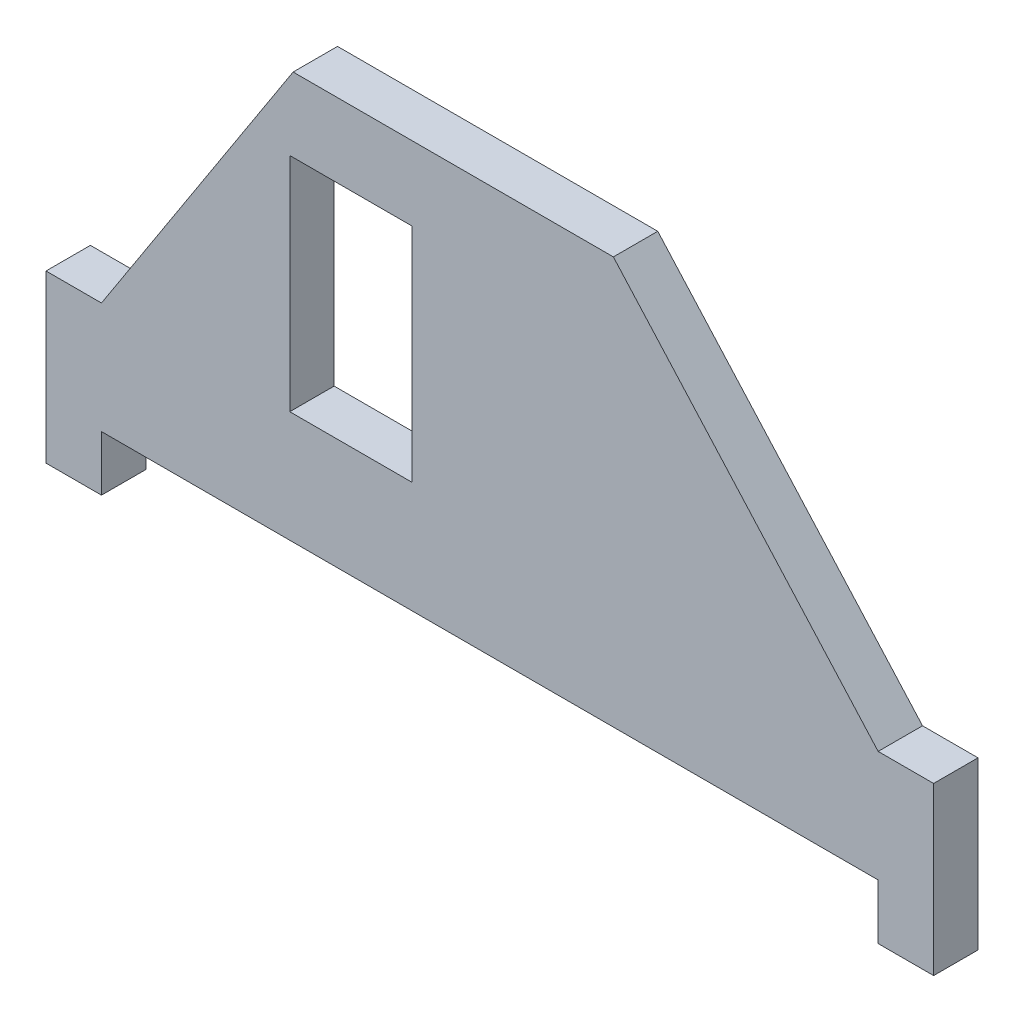
ISO-10303-21;
HEADER;
FILE_DESCRIPTION(('STEP AP214'),'2;1');
FILE_NAME('part.step','',(''),(''),'','','');
FILE_SCHEMA(('AUTOMOTIVE_DESIGN { 1 0 10303 214 1 1 1 1 }'));
ENDSEC;
DATA;
#1=APPLICATION_CONTEXT('core data for automotive mechanical design processes');
#2=APPLICATION_PROTOCOL_DEFINITION('international standard','automotive_design',2000,#1);
#3=PRODUCT_CONTEXT('',#1,'mechanical');
#4=PRODUCT('Part','Part','',(#3));
#5=PRODUCT_RELATED_PRODUCT_CATEGORY('part','',(#4));
#6=PRODUCT_DEFINITION_FORMATION('','',#4);
#7=PRODUCT_DEFINITION_CONTEXT('part definition',#1,'design');
#8=PRODUCT_DEFINITION('design','',#6,#7);
#9=PRODUCT_DEFINITION_SHAPE('','',#8);
#10=(LENGTH_UNIT() NAMED_UNIT(*) SI_UNIT(.MILLI.,.METRE.));
#11=(NAMED_UNIT(*) PLANE_ANGLE_UNIT() SI_UNIT($,.RADIAN.));
#12=(NAMED_UNIT(*) SI_UNIT($,.STERADIAN.) SOLID_ANGLE_UNIT());
#13=UNCERTAINTY_MEASURE_WITH_UNIT(LENGTH_MEASURE(1.E-05),#10,'distance_accuracy_value','');
#14=(GEOMETRIC_REPRESENTATION_CONTEXT(3) GLOBAL_UNCERTAINTY_ASSIGNED_CONTEXT((#13)) GLOBAL_UNIT_ASSIGNED_CONTEXT((#10,
#11,#12)) REPRESENTATION_CONTEXT('',''));
#15=CARTESIAN_POINT('',(0.,0.,0.));
#16=DIRECTION('',(0.,0.,1.));
#17=DIRECTION('',(1.,0.,0.));
#18=AXIS2_PLACEMENT_3D('',#15,#16,#17);
#19=CARTESIAN_POINT('',(1905.,0.,101.6));
#20=DIRECTION('',(-1.,0.,0.));
#21=DIRECTION('',(0.,0.,1.));
#22=AXIS2_PLACEMENT_3D('',#19,#20,#21);
#23=PLANE('',#22);
#24=DIRECTION('',(0.,1.,0.));
#25=VECTOR('',#24,1.);
#26=CARTESIAN_POINT('',(1905.,0.,0.));
#27=LINE('',#26,#25);
#28=CARTESIAN_POINT('',(1905.,0.,0.));
#29=VERTEX_POINT('',#28);
#30=CARTESIAN_POINT('',(1905.,126.13351164283,0.));
#31=VERTEX_POINT('',#30);
#32=EDGE_CURVE('E241',#29,#31,#27,.T.);
#33=ORIENTED_EDGE('',*,*,#32,.F.);
#34=DIRECTION('',(0.,0.,-1.));
#35=VECTOR('',#34,1.);
#36=CARTESIAN_POINT('',(1905.,0.,101.6));
#37=LINE('',#36,#35);
#38=CARTESIAN_POINT('',(1905.,0.,101.6));
#39=VERTEX_POINT('',#38);
#40=EDGE_CURVE('E11',#39,#29,#37,.T.);
#41=ORIENTED_EDGE('',*,*,#40,.F.);
#42=DIRECTION('',(0.,1.,0.));
#43=VECTOR('',#42,1.);
#44=CARTESIAN_POINT('',(1905.,0.,101.6));
#45=LINE('',#44,#43);
#46=CARTESIAN_POINT('',(1905.,126.13351164283,101.6));
#47=VERTEX_POINT('',#46);
#48=EDGE_CURVE('E276',#39,#47,#45,.T.);
#49=ORIENTED_EDGE('',*,*,#48,.T.);
#50=DIRECTION('',(0.,0.,-1.));
#51=VECTOR('',#50,1.);
#52=CARTESIAN_POINT('',(1905.,126.13351164283,101.6));
#53=LINE('',#52,#51);
#54=EDGE_CURVE('E112',#47,#31,#53,.T.);
#55=ORIENTED_EDGE('',*,*,#54,.T.);
#56=EDGE_LOOP('',(#33,#41,#49,#55));
#57=FACE_BOUND('',#56,.T.);
#58=ADVANCED_FACE('F35',(#57),#23,.T.);
#59=CARTESIAN_POINT('',(0.,0.,101.6));
#60=DIRECTION('',(0.,1.,0.));
#61=DIRECTION('',(0.,0.,1.));
#62=AXIS2_PLACEMENT_3D('',#59,#60,#61);
#63=PLANE('',#62);
#64=DIRECTION('',(1.,0.,0.));
#65=VECTOR('',#64,1.);
#66=CARTESIAN_POINT('',(0.,0.,0.));
#67=LINE('',#66,#65);
#68=CARTESIAN_POINT('',(2032.,0.,0.));
#69=VERTEX_POINT('',#68);
#70=EDGE_CURVE('E238',#29,#69,#67,.T.);
#71=ORIENTED_EDGE('',*,*,#70,.T.);
#72=DIRECTION('',(0.,0.,-1.));
#73=VECTOR('',#72,1.);
#74=CARTESIAN_POINT('',(2032.,0.,101.6));
#75=LINE('',#74,#73);
#76=CARTESIAN_POINT('',(2032.,0.,101.6));
#77=VERTEX_POINT('',#76);
#78=EDGE_CURVE('E45',#77,#69,#75,.T.);
#79=ORIENTED_EDGE('',*,*,#78,.F.);
#80=DIRECTION('',(1.,0.,0.));
#81=VECTOR('',#80,1.);
#82=CARTESIAN_POINT('',(0.,0.,101.6));
#83=LINE('',#82,#81);
#84=EDGE_CURVE('E273',#39,#77,#83,.T.);
#85=ORIENTED_EDGE('',*,*,#84,.F.);
#86=ORIENTED_EDGE('',*,*,#40,.T.);
#87=EDGE_LOOP('',(#71,#79,#85,#86));
#88=FACE_BOUND('',#87,.T.);
#89=ADVANCED_FACE('F302',(#88),#63,.F.);
#90=CARTESIAN_POINT('',(2032.,0.,101.6));
#91=DIRECTION('',(-1.,0.,0.));
#92=DIRECTION('',(0.,0.,1.));
#93=AXIS2_PLACEMENT_3D('',#90,#91,#92);
#94=PLANE('',#93);
#95=DIRECTION('',(0.,1.,0.));
#96=VECTOR('',#95,1.);
#97=CARTESIAN_POINT('',(2032.,0.,0.));
#98=LINE('',#97,#96);
#99=CARTESIAN_POINT('',(2032.,381.,0.));
#100=VERTEX_POINT('',#99);
#101=EDGE_CURVE('E235',#69,#100,#98,.T.);
#102=ORIENTED_EDGE('',*,*,#101,.T.);
#103=DIRECTION('',(0.,0.,-1.));
#104=VECTOR('',#103,1.);
#105=CARTESIAN_POINT('',(2032.,381.,101.6));
#106=LINE('',#105,#104);
#107=CARTESIAN_POINT('',(2032.,381.,101.6));
#108=VERTEX_POINT('',#107);
#109=EDGE_CURVE('E196',#108,#100,#106,.T.);
#110=ORIENTED_EDGE('',*,*,#109,.F.);
#111=DIRECTION('',(0.,1.,0.));
#112=VECTOR('',#111,1.);
#113=CARTESIAN_POINT('',(2032.,0.,101.6));
#114=LINE('',#113,#112);
#115=EDGE_CURVE('E271',#77,#108,#114,.T.);
#116=ORIENTED_EDGE('',*,*,#115,.F.);
#117=ORIENTED_EDGE('',*,*,#78,.T.);
#118=EDGE_LOOP('',(#102,#110,#116,#117));
#119=FACE_BOUND('',#118,.T.);
#120=ADVANCED_FACE('F307',(#119),#94,.F.);
#121=CARTESIAN_POINT('',(0.,381.,101.6));
#122=DIRECTION('',(0.,1.,0.));
#123=DIRECTION('',(0.,0.,1.));
#124=AXIS2_PLACEMENT_3D('',#121,#122,#123);
#125=PLANE('',#124);
#126=DIRECTION('',(1.,0.,0.));
#127=VECTOR('',#126,1.);
#128=CARTESIAN_POINT('',(0.,381.,0.));
#129=LINE('',#128,#127);
#130=CARTESIAN_POINT('',(1905.,381.,0.));
#131=VERTEX_POINT('',#130);
#132=EDGE_CURVE('E232',#131,#100,#129,.T.);
#133=ORIENTED_EDGE('',*,*,#132,.F.);
#134=DIRECTION('',(0.,0.,-1.));
#135=VECTOR('',#134,1.);
#136=CARTESIAN_POINT('',(1905.,381.,101.6));
#137=LINE('',#136,#135);
#138=CARTESIAN_POINT('',(1905.,381.,101.6));
#139=VERTEX_POINT('',#138);
#140=EDGE_CURVE('E194',#139,#131,#137,.T.);
#141=ORIENTED_EDGE('',*,*,#140,.F.);
#142=DIRECTION('',(1.,0.,0.));
#143=VECTOR('',#142,1.);
#144=CARTESIAN_POINT('',(0.,381.,101.6));
#145=LINE('',#144,#143);
#146=EDGE_CURVE('E268',#139,#108,#145,.T.);
#147=ORIENTED_EDGE('',*,*,#146,.T.);
#148=ORIENTED_EDGE('',*,*,#109,.T.);
#149=EDGE_LOOP('',(#133,#141,#147,#148));
#150=FACE_BOUND('',#149,.T.);
#151=ADVANCED_FACE('F310',(#150),#125,.T.);
#152=CARTESIAN_POINT('',(1247.19252808395,1116.08241874589,101.6));
#153=DIRECTION('',(0.745189852710884,0.666852370031577,0.));
#154=DIRECTION('',(-0.666852370031577,0.745189852710884,0.));
#155=AXIS2_PLACEMENT_3D('',#152,#153,#154);
#156=PLANE('',#155);
#157=DIRECTION('',(0.666852370031577,-0.745189852710884,0.));
#158=VECTOR('',#157,1.);
#159=CARTESIAN_POINT('',(1247.19252808395,1116.08241874589,0.));
#160=LINE('',#159,#158);
#161=CARTESIAN_POINT('',(1298.87078743548,1058.33333333333,0.));
#162=VERTEX_POINT('',#161);
#163=EDGE_CURVE('E229',#162,#131,#160,.T.);
#164=ORIENTED_EDGE('',*,*,#163,.F.);
#165=DIRECTION('',(0.,0.,-1.));
#166=VECTOR('',#165,1.);
#167=CARTESIAN_POINT('',(1298.87078743548,1058.33333333333,101.6));
#168=LINE('',#167,#166);
#169=CARTESIAN_POINT('',(1298.87078743548,1058.33333333333,101.6));
#170=VERTEX_POINT('',#169);
#171=EDGE_CURVE('E192',#170,#162,#168,.T.);
#172=ORIENTED_EDGE('',*,*,#171,.F.);
#173=DIRECTION('',(0.666852370031577,-0.745189852710884,0.));
#174=VECTOR('',#173,1.);
#175=CARTESIAN_POINT('',(1247.19252808395,1116.08241874589,101.6));
#176=LINE('',#175,#174);
#177=EDGE_CURVE('E265',#170,#139,#176,.T.);
#178=ORIENTED_EDGE('',*,*,#177,.T.);
#179=ORIENTED_EDGE('',*,*,#140,.T.);
#180=EDGE_LOOP('',(#164,#172,#178,#179));
#181=FACE_BOUND('',#180,.T.);
#182=ADVANCED_FACE('F313',(#181),#156,.T.);
#183=CARTESIAN_POINT('',(0.,1058.33333333333,101.6));
#184=DIRECTION('',(0.,1.,0.));
#185=DIRECTION('',(0.,0.,1.));
#186=AXIS2_PLACEMENT_3D('',#183,#184,#185);
#187=PLANE('',#186);
#188=DIRECTION('',(1.,0.,0.));
#189=VECTOR('',#188,1.);
#190=CARTESIAN_POINT('',(0.,1058.33333333333,0.));
#191=LINE('',#190,#189);
#192=CARTESIAN_POINT('',(565.751483096429,1058.33333333333,0.));
#193=VERTEX_POINT('',#192);
#194=EDGE_CURVE('E226',#193,#162,#191,.T.);
#195=ORIENTED_EDGE('',*,*,#194,.F.);
#196=DIRECTION('',(0.,0.,-1.));
#197=VECTOR('',#196,1.);
#198=CARTESIAN_POINT('',(565.751483096429,1058.33333333333,101.6));
#199=LINE('',#198,#197);
#200=CARTESIAN_POINT('',(565.751483096429,1058.33333333333,101.6));
#201=VERTEX_POINT('',#200);
#202=EDGE_CURVE('E190',#201,#193,#199,.T.);
#203=ORIENTED_EDGE('',*,*,#202,.F.);
#204=DIRECTION('',(1.,0.,0.));
#205=VECTOR('',#204,1.);
#206=CARTESIAN_POINT('',(0.,1058.33333333333,101.6));
#207=LINE('',#206,#205);
#208=EDGE_CURVE('E262',#201,#170,#207,.T.);
#209=ORIENTED_EDGE('',*,*,#208,.T.);
#210=ORIENTED_EDGE('',*,*,#171,.T.);
#211=EDGE_LOOP('',(#195,#203,#209,#210));
#212=FACE_BOUND('',#211,.T.);
#213=ADVANCED_FACE('F318',(#212),#187,.T.);
#214=CARTESIAN_POINT('',(-84.3885381116742,54.6637739953296,101.6));
#215=DIRECTION('',(-0.839300486720766,0.543667814929563,0.));
#216=DIRECTION('',(-0.543667814929563,-0.839300486720766,0.));
#217=AXIS2_PLACEMENT_3D('',#214,#215,#216);
#218=PLANE('',#217);
#219=DIRECTION('',(0.543667814929563,0.839300486720766,0.));
#220=VECTOR('',#219,1.);
#221=CARTESIAN_POINT('',(-84.3885381116742,54.6637739953296,0.));
#222=LINE('',#221,#220);
#223=CARTESIAN_POINT('',(127.,381.,0.));
#224=VERTEX_POINT('',#223);
#225=EDGE_CURVE('E223',#224,#193,#222,.T.);
#226=ORIENTED_EDGE('',*,*,#225,.F.);
#227=DIRECTION('',(0.,0.,-1.));
#228=VECTOR('',#227,1.);
#229=CARTESIAN_POINT('',(127.,381.,101.6));
#230=LINE('',#229,#228);
#231=CARTESIAN_POINT('',(127.,381.,101.6));
#232=VERTEX_POINT('',#231);
#233=EDGE_CURVE('E188',#232,#224,#230,.T.);
#234=ORIENTED_EDGE('',*,*,#233,.F.);
#235=DIRECTION('',(0.543667814929563,0.839300486720766,0.));
#236=VECTOR('',#235,1.);
#237=CARTESIAN_POINT('',(-84.3885381116742,54.6637739953296,101.6));
#238=LINE('',#237,#236);
#239=EDGE_CURVE('E259',#232,#201,#238,.T.);
#240=ORIENTED_EDGE('',*,*,#239,.T.);
#241=ORIENTED_EDGE('',*,*,#202,.T.);
#242=EDGE_LOOP('',(#226,#234,#240,#241));
#243=FACE_BOUND('',#242,.T.);
#244=ADVANCED_FACE('F321',(#243),#218,.T.);
#245=CARTESIAN_POINT('',(0.,381.,101.6));
#246=DIRECTION('',(0.,1.,0.));
#247=DIRECTION('',(0.,0.,1.));
#248=AXIS2_PLACEMENT_3D('',#245,#246,#247);
#249=PLANE('',#248);
#250=DIRECTION('',(1.,0.,0.));
#251=VECTOR('',#250,1.);
#252=CARTESIAN_POINT('',(0.,381.,0.));
#253=LINE('',#252,#251);
#254=CARTESIAN_POINT('',(0.,381.,0.));
#255=VERTEX_POINT('',#254);
#256=EDGE_CURVE('E220',#255,#224,#253,.T.);
#257=ORIENTED_EDGE('',*,*,#256,.F.);
#258=DIRECTION('',(0.,0.,-1.));
#259=VECTOR('',#258,1.);
#260=CARTESIAN_POINT('',(0.,381.,101.6));
#261=LINE('',#260,#259);
#262=CARTESIAN_POINT('',(0.,381.,101.6));
#263=VERTEX_POINT('',#262);
#264=EDGE_CURVE('E182',#263,#255,#261,.T.);
#265=ORIENTED_EDGE('',*,*,#264,.F.);
#266=DIRECTION('',(1.,0.,0.));
#267=VECTOR('',#266,1.);
#268=CARTESIAN_POINT('',(0.,381.,101.6));
#269=LINE('',#268,#267);
#270=EDGE_CURVE('E256',#263,#232,#269,.T.);
#271=ORIENTED_EDGE('',*,*,#270,.T.);
#272=ORIENTED_EDGE('',*,*,#233,.T.);
#273=EDGE_LOOP('',(#257,#265,#271,#272));
#274=FACE_BOUND('',#273,.T.);
#275=ADVANCED_FACE('F324',(#274),#249,.T.);
#276=CARTESIAN_POINT('',(0.,0.,101.6));
#277=DIRECTION('',(-1.,0.,0.));
#278=DIRECTION('',(0.,0.,1.));
#279=AXIS2_PLACEMENT_3D('',#276,#277,#278);
#280=PLANE('',#279);
#281=DIRECTION('',(0.,1.,0.));
#282=VECTOR('',#281,1.);
#283=CARTESIAN_POINT('',(0.,0.,0.));
#284=LINE('',#283,#282);
#285=CARTESIAN_POINT('',(0.,0.,0.));
#286=VERTEX_POINT('',#285);
#287=EDGE_CURVE('E217',#286,#255,#284,.T.);
#288=ORIENTED_EDGE('',*,*,#287,.F.);
#289=DIRECTION('',(0.,0.,-1.));
#290=VECTOR('',#289,1.);
#291=CARTESIAN_POINT('',(0.,0.,101.6));
#292=LINE('',#291,#290);
#293=CARTESIAN_POINT('',(0.,0.,101.6));
#294=VERTEX_POINT('',#293);
#295=EDGE_CURVE('E180',#294,#286,#292,.T.);
#296=ORIENTED_EDGE('',*,*,#295,.F.);
#297=DIRECTION('',(0.,1.,0.));
#298=VECTOR('',#297,1.);
#299=CARTESIAN_POINT('',(0.,0.,101.6));
#300=LINE('',#299,#298);
#301=EDGE_CURVE('E174',#294,#263,#300,.T.);
#302=ORIENTED_EDGE('',*,*,#301,.T.);
#303=ORIENTED_EDGE('',*,*,#264,.T.);
#304=EDGE_LOOP('',(#288,#296,#302,#303));
#305=FACE_BOUND('',#304,.T.);
#306=ADVANCED_FACE('F327',(#305),#280,.T.);
#307=CARTESIAN_POINT('',(0.,0.,101.6));
#308=DIRECTION('',(0.,1.,0.));
#309=DIRECTION('',(0.,0.,1.));
#310=AXIS2_PLACEMENT_3D('',#307,#308,#309);
#311=PLANE('',#310);
#312=DIRECTION('',(1.,0.,0.));
#313=VECTOR('',#312,1.);
#314=CARTESIAN_POINT('',(0.,0.,0.));
#315=LINE('',#314,#313);
#316=CARTESIAN_POINT('',(127.,0.,0.));
#317=VERTEX_POINT('',#316);
#318=EDGE_CURVE('E179',#286,#317,#315,.T.);
#319=ORIENTED_EDGE('',*,*,#318,.T.);
#320=DIRECTION('',(0.,0.,-1.));
#321=VECTOR('',#320,1.);
#322=CARTESIAN_POINT('',(127.,0.,101.6));
#323=LINE('',#322,#321);
#324=CARTESIAN_POINT('',(127.,0.,101.6));
#325=VERTEX_POINT('',#324);
#326=EDGE_CURVE('E164',#325,#317,#323,.T.);
#327=ORIENTED_EDGE('',*,*,#326,.F.);
#328=DIRECTION('',(1.,0.,0.));
#329=VECTOR('',#328,1.);
#330=CARTESIAN_POINT('',(0.,0.,101.6));
#331=LINE('',#330,#329);
#332=EDGE_CURVE('E167',#294,#325,#331,.T.);
#333=ORIENTED_EDGE('',*,*,#332,.F.);
#334=ORIENTED_EDGE('',*,*,#295,.T.);
#335=EDGE_LOOP('',(#319,#327,#333,#334));
#336=FACE_BOUND('',#335,.T.);
#337=ADVANCED_FACE('F177',(#336),#311,.F.);
#338=CARTESIAN_POINT('',(127.,0.,101.6));
#339=DIRECTION('',(-1.,0.,0.));
#340=DIRECTION('',(0.,0.,1.));
#341=AXIS2_PLACEMENT_3D('',#338,#339,#340);
#342=PLANE('',#341);
#343=DIRECTION('',(0.,1.,0.));
#344=VECTOR('',#343,1.);
#345=CARTESIAN_POINT('',(127.,0.,0.));
#346=LINE('',#345,#344);
#347=CARTESIAN_POINT('',(127.,126.13351164283,0.));
#348=VERTEX_POINT('',#347);
#349=EDGE_CURVE('E214',#317,#348,#346,.T.);
#350=ORIENTED_EDGE('',*,*,#349,.T.);
#351=DIRECTION('',(0.,0.,-1.));
#352=VECTOR('',#351,1.);
#353=CARTESIAN_POINT('',(127.,126.13351164283,101.6));
#354=LINE('',#353,#352);
#355=CARTESIAN_POINT('',(127.,126.13351164283,101.6));
#356=VERTEX_POINT('',#355);
#357=EDGE_CURVE('E166',#356,#348,#354,.T.);
#358=ORIENTED_EDGE('',*,*,#357,.F.);
#359=DIRECTION('',(0.,1.,0.));
#360=VECTOR('',#359,1.);
#361=CARTESIAN_POINT('',(127.,0.,101.6));
#362=LINE('',#361,#360);
#363=EDGE_CURVE('E159',#325,#356,#362,.T.);
#364=ORIENTED_EDGE('',*,*,#363,.F.);
#365=ORIENTED_EDGE('',*,*,#326,.T.);
#366=EDGE_LOOP('',(#350,#358,#364,#365));
#367=FACE_BOUND('',#366,.T.);
#368=ADVANCED_FACE('F162',(#367),#342,.F.);
#369=CARTESIAN_POINT('',(837.438,0.,101.6));
#370=DIRECTION('',(-1.,0.,0.));
#371=DIRECTION('',(0.,0.,1.));
#372=AXIS2_PLACEMENT_3D('',#369,#370,#371);
#373=PLANE('',#372);
#374=DIRECTION('',(0.,1.,0.));
#375=VECTOR('',#374,1.);
#376=CARTESIAN_POINT('',(837.438,0.,0.));
#377=LINE('',#376,#375);
#378=CARTESIAN_POINT('',(837.438,381.,0.));
#379=VERTEX_POINT('',#378);
#380=CARTESIAN_POINT('',(837.438,889.,0.));
#381=VERTEX_POINT('',#380);
#382=EDGE_CURVE('E251',#379,#381,#377,.T.);
#383=ORIENTED_EDGE('',*,*,#382,.F.);
#384=DIRECTION('',(0.,0.,-1.));
#385=VECTOR('',#384,1.);
#386=CARTESIAN_POINT('',(837.438,381.,101.6));
#387=LINE('',#386,#385);
#388=CARTESIAN_POINT('',(837.438,381.,101.6));
#389=VERTEX_POINT('',#388);
#390=EDGE_CURVE('E39',#389,#379,#387,.T.);
#391=ORIENTED_EDGE('',*,*,#390,.F.);
#392=DIRECTION('',(0.,1.,0.));
#393=VECTOR('',#392,1.);
#394=CARTESIAN_POINT('',(837.438,0.,101.6));
#395=LINE('',#394,#393);
#396=CARTESIAN_POINT('',(837.438,889.,101.6));
#397=VERTEX_POINT('',#396);
#398=EDGE_CURVE('E213',#389,#397,#395,.T.);
#399=ORIENTED_EDGE('',*,*,#398,.T.);
#400=DIRECTION('',(0.,0.,-1.));
#401=VECTOR('',#400,1.);
#402=CARTESIAN_POINT('',(837.438,889.,101.6));
#403=LINE('',#402,#401);
#404=EDGE_CURVE('E200',#397,#381,#403,.T.);
#405=ORIENTED_EDGE('',*,*,#404,.T.);
#406=EDGE_LOOP('',(#383,#391,#399,#405));
#407=FACE_BOUND('',#406,.T.);
#408=ADVANCED_FACE('F37',(#407),#373,.T.);
#409=CARTESIAN_POINT('',(0.,381.,101.6));
#410=DIRECTION('',(0.,1.,0.));
#411=DIRECTION('',(0.,0.,1.));
#412=AXIS2_PLACEMENT_3D('',#409,#410,#411);
#413=PLANE('',#412);
#414=DIRECTION('',(1.,0.,0.));
#415=VECTOR('',#414,1.);
#416=CARTESIAN_POINT('',(0.,381.,0.));
#417=LINE('',#416,#415);
#418=CARTESIAN_POINT('',(558.038,381.,0.));
#419=VERTEX_POINT('',#418);
#420=EDGE_CURVE('E248',#419,#379,#417,.T.);
#421=ORIENTED_EDGE('',*,*,#420,.F.);
#422=DIRECTION('',(0.,0.,-1.));
#423=VECTOR('',#422,1.);
#424=CARTESIAN_POINT('',(558.038,381.,101.6));
#425=LINE('',#424,#423);
#426=CARTESIAN_POINT('',(558.038,381.,101.6));
#427=VERTEX_POINT('',#426);
#428=EDGE_CURVE('E204',#427,#419,#425,.T.);
#429=ORIENTED_EDGE('',*,*,#428,.F.);
#430=DIRECTION('',(1.,0.,0.));
#431=VECTOR('',#430,1.);
#432=CARTESIAN_POINT('',(0.,381.,101.6));
#433=LINE('',#432,#431);
#434=EDGE_CURVE('E282',#427,#389,#433,.T.);
#435=ORIENTED_EDGE('',*,*,#434,.T.);
#436=ORIENTED_EDGE('',*,*,#390,.T.);
#437=EDGE_LOOP('',(#421,#429,#435,#436));
#438=FACE_BOUND('',#437,.T.);
#439=ADVANCED_FACE('F288',(#438),#413,.T.);
#440=CARTESIAN_POINT('',(558.038,0.,101.6));
#441=DIRECTION('',(-1.,0.,0.));
#442=DIRECTION('',(0.,0.,1.));
#443=AXIS2_PLACEMENT_3D('',#440,#441,#442);
#444=PLANE('',#443);
#445=DIRECTION('',(0.,1.,0.));
#446=VECTOR('',#445,1.);
#447=CARTESIAN_POINT('',(558.038,0.,0.));
#448=LINE('',#447,#446);
#449=CARTESIAN_POINT('',(558.038,889.,0.));
#450=VERTEX_POINT('',#449);
#451=EDGE_CURVE('E246',#419,#450,#448,.T.);
#452=ORIENTED_EDGE('',*,*,#451,.T.);
#453=DIRECTION('',(0.,0.,-1.));
#454=VECTOR('',#453,1.);
#455=CARTESIAN_POINT('',(558.038,889.,101.6));
#456=LINE('',#455,#454);
#457=CARTESIAN_POINT('',(558.038,889.,101.6));
#458=VERTEX_POINT('',#457);
#459=EDGE_CURVE('E202',#458,#450,#456,.T.);
#460=ORIENTED_EDGE('',*,*,#459,.F.);
#461=DIRECTION('',(0.,1.,0.));
#462=VECTOR('',#461,1.);
#463=CARTESIAN_POINT('',(558.038,0.,101.6));
#464=LINE('',#463,#462);
#465=EDGE_CURVE('E280',#427,#458,#464,.T.);
#466=ORIENTED_EDGE('',*,*,#465,.F.);
#467=ORIENTED_EDGE('',*,*,#428,.T.);
#468=EDGE_LOOP('',(#452,#460,#466,#467));
#469=FACE_BOUND('',#468,.T.);
#470=ADVANCED_FACE('F290',(#469),#444,.F.);
#471=CARTESIAN_POINT('',(0.,889.,101.6));
#472=DIRECTION('',(0.,1.,0.));
#473=DIRECTION('',(0.,0.,1.));
#474=AXIS2_PLACEMENT_3D('',#471,#472,#473);
#475=PLANE('',#474);
#476=DIRECTION('',(1.,0.,0.));
#477=VECTOR('',#476,1.);
#478=CARTESIAN_POINT('',(0.,889.,0.));
#479=LINE('',#478,#477);
#480=EDGE_CURVE('E243',#450,#381,#479,.T.);
#481=ORIENTED_EDGE('',*,*,#480,.T.);
#482=ORIENTED_EDGE('',*,*,#404,.F.);
#483=DIRECTION('',(1.,0.,0.));
#484=VECTOR('',#483,1.);
#485=CARTESIAN_POINT('',(0.,889.,101.6));
#486=LINE('',#485,#484);
#487=EDGE_CURVE('E278',#458,#397,#486,.T.);
#488=ORIENTED_EDGE('',*,*,#487,.F.);
#489=ORIENTED_EDGE('',*,*,#459,.T.);
#490=EDGE_LOOP('',(#481,#482,#488,#489));
#491=FACE_BOUND('',#490,.T.);
#492=ADVANCED_FACE('F293',(#491),#475,.F.);
#493=CARTESIAN_POINT('',(0.,126.13351164283,101.6));
#494=DIRECTION('',(0.,1.,0.));
#495=DIRECTION('',(0.,0.,1.));
#496=AXIS2_PLACEMENT_3D('',#493,#494,#495);
#497=PLANE('',#496);
#498=DIRECTION('',(1.,0.,0.));
#499=VECTOR('',#498,1.);
#500=CARTESIAN_POINT('',(0.,126.13351164283,0.));
#501=LINE('',#500,#499);
#502=EDGE_CURVE('E105',#348,#31,#501,.T.);
#503=ORIENTED_EDGE('',*,*,#502,.T.);
#504=ORIENTED_EDGE('',*,*,#54,.F.);
#505=DIRECTION('',(1.,0.,0.));
#506=VECTOR('',#505,1.);
#507=CARTESIAN_POINT('',(0.,126.13351164283,101.6));
#508=LINE('',#507,#506);
#509=EDGE_CURVE('E54',#356,#47,#508,.T.);
#510=ORIENTED_EDGE('',*,*,#509,.F.);
#511=ORIENTED_EDGE('',*,*,#357,.T.);
#512=EDGE_LOOP('',(#503,#504,#510,#511));
#513=FACE_BOUND('',#512,.T.);
#514=ADVANCED_FACE('F346',(#513),#497,.F.);
#515=CARTESIAN_POINT('',(0.,0.,101.6));
#516=DIRECTION('',(0.,0.,1.));
#517=DIRECTION('',(1.,0.,0.));
#518=AXIS2_PLACEMENT_3D('',#515,#516,#517);
#519=PLANE('',#518);
#520=ORIENTED_EDGE('',*,*,#398,.F.);
#521=ORIENTED_EDGE('',*,*,#434,.F.);
#522=ORIENTED_EDGE('',*,*,#465,.T.);
#523=ORIENTED_EDGE('',*,*,#487,.T.);
#524=EDGE_LOOP('',(#520,#521,#522,#523));
#525=FACE_BOUND('',#524,.T.);
#526=ORIENTED_EDGE('',*,*,#48,.F.);
#527=ORIENTED_EDGE('',*,*,#84,.T.);
#528=ORIENTED_EDGE('',*,*,#115,.T.);
#529=ORIENTED_EDGE('',*,*,#146,.F.);
#530=ORIENTED_EDGE('',*,*,#177,.F.);
#531=ORIENTED_EDGE('',*,*,#208,.F.);
#532=ORIENTED_EDGE('',*,*,#239,.F.);
#533=ORIENTED_EDGE('',*,*,#270,.F.);
#534=ORIENTED_EDGE('',*,*,#301,.F.);
#535=ORIENTED_EDGE('',*,*,#332,.T.);
#536=ORIENTED_EDGE('',*,*,#363,.T.);
#537=ORIENTED_EDGE('',*,*,#509,.T.);
#538=EDGE_LOOP('',(#526,#527,#528,#529,#530,#531,#532,#533,#534,#535,#536,#537));
#539=FACE_BOUND('',#538,.T.);
#540=ADVANCED_FACE('F171',(#525,#539),#519,.T.);
#541=CARTESIAN_POINT('',(0.,0.,0.));
#542=DIRECTION('',(0.,0.,1.));
#543=DIRECTION('',(1.,0.,0.));
#544=AXIS2_PLACEMENT_3D('',#541,#542,#543);
#545=PLANE('',#544);
#546=ORIENTED_EDGE('',*,*,#382,.T.);
#547=ORIENTED_EDGE('',*,*,#480,.F.);
#548=ORIENTED_EDGE('',*,*,#451,.F.);
#549=ORIENTED_EDGE('',*,*,#420,.T.);
#550=EDGE_LOOP('',(#546,#547,#548,#549));
#551=FACE_BOUND('',#550,.T.);
#552=ORIENTED_EDGE('',*,*,#32,.T.);
#553=ORIENTED_EDGE('',*,*,#502,.F.);
#554=ORIENTED_EDGE('',*,*,#349,.F.);
#555=ORIENTED_EDGE('',*,*,#318,.F.);
#556=ORIENTED_EDGE('',*,*,#287,.T.);
#557=ORIENTED_EDGE('',*,*,#256,.T.);
#558=ORIENTED_EDGE('',*,*,#225,.T.);
#559=ORIENTED_EDGE('',*,*,#194,.T.);
#560=ORIENTED_EDGE('',*,*,#163,.T.);
#561=ORIENTED_EDGE('',*,*,#132,.T.);
#562=ORIENTED_EDGE('',*,*,#101,.F.);
#563=ORIENTED_EDGE('',*,*,#70,.F.);
#564=EDGE_LOOP('',(#552,#553,#554,#555,#556,#557,#558,#559,#560,#561,#562,#563));
#565=FACE_BOUND('',#564,.T.);
#566=ADVANCED_FACE('F295',(#551,#565),#545,.F.);
#567=CLOSED_SHELL('',(#58,#89,#120,#151,#182,#213,#244,#275,#306,#337,#368,#408,#439,#470,#492,
#514,#540,#566));
#568=MANIFOLD_SOLID_BREP('B2',#567);
#569=ADVANCED_BREP_SHAPE_REPRESENTATION('',(#18,#568),#14);
#570=SHAPE_DEFINITION_REPRESENTATION(#9,#569);
ENDSEC;
END-ISO-10303-21;
